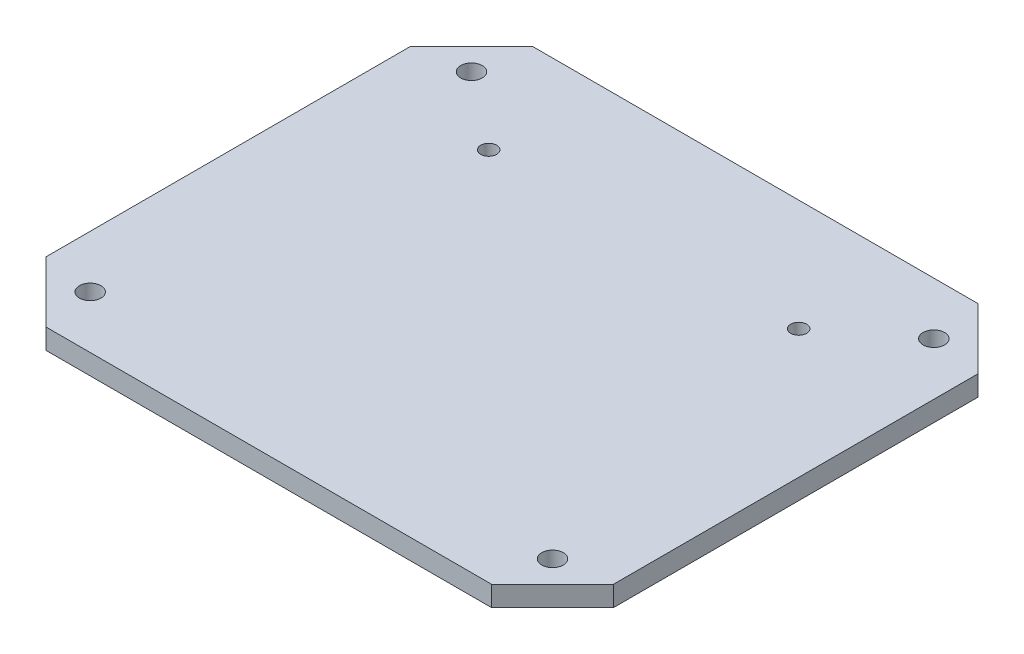
ISO-10303-21;
HEADER;
FILE_DESCRIPTION(('STEP AP214'),'2;1');
FILE_NAME('part.step','',(''),(''),'','','');
FILE_SCHEMA(('AUTOMOTIVE_DESIGN { 1 0 10303 214 1 1 1 1 }'));
ENDSEC;
DATA;
#1=APPLICATION_CONTEXT('core data for automotive mechanical design processes');
#2=APPLICATION_PROTOCOL_DEFINITION('international standard','automotive_design',2000,#1);
#3=PRODUCT_CONTEXT('',#1,'mechanical');
#4=PRODUCT('Part','Part','',(#3));
#5=PRODUCT_RELATED_PRODUCT_CATEGORY('part','',(#4));
#6=PRODUCT_DEFINITION_FORMATION('','',#4);
#7=PRODUCT_DEFINITION_CONTEXT('part definition',#1,'design');
#8=PRODUCT_DEFINITION('design','',#6,#7);
#9=PRODUCT_DEFINITION_SHAPE('','',#8);
#10=(LENGTH_UNIT() NAMED_UNIT(*) SI_UNIT(.MILLI.,.METRE.));
#11=(NAMED_UNIT(*) PLANE_ANGLE_UNIT() SI_UNIT($,.RADIAN.));
#12=(NAMED_UNIT(*) SI_UNIT($,.STERADIAN.) SOLID_ANGLE_UNIT());
#13=UNCERTAINTY_MEASURE_WITH_UNIT(LENGTH_MEASURE(1.E-05),#10,'distance_accuracy_value','');
#14=(GEOMETRIC_REPRESENTATION_CONTEXT(3) GLOBAL_UNCERTAINTY_ASSIGNED_CONTEXT((#13)) GLOBAL_UNIT_ASSIGNED_CONTEXT((#10,
#11,#12)) REPRESENTATION_CONTEXT('',''));
#15=CARTESIAN_POINT('',(0.,0.,0.));
#16=DIRECTION('',(0.,0.,1.));
#17=DIRECTION('',(1.,0.,0.));
#18=AXIS2_PLACEMENT_3D('',#15,#16,#17);
#19=CARTESIAN_POINT('',(0.,-6.35,0.));
#20=DIRECTION('',(0.,1.,0.));
#21=DIRECTION('',(0.,0.,1.));
#22=AXIS2_PLACEMENT_3D('',#19,#20,#21);
#23=PLANE('',#22);
#24=CARTESIAN_POINT('',(48.5775,-6.35,-41.275));
#25=DIRECTION('',(0.,1.,0.));
#26=DIRECTION('',(0.,0.,1.));
#27=AXIS2_PLACEMENT_3D('',#24,#25,#26);
#28=CIRCLE('',#27,2.5);
#29=CARTESIAN_POINT('',(48.5775,-6.35,-38.775));
#30=VERTEX_POINT('',#29);
#31=EDGE_CURVE('E214',#30,#30,#28,.T.);
#32=ORIENTED_EDGE('',*,*,#31,.T.);
#33=EDGE_LOOP('',(#32));
#34=FACE_BOUND('',#33,.T.);
#35=CARTESIAN_POINT('',(-48.5775,-6.35,-41.275));
#36=DIRECTION('',(0.,1.,0.));
#37=DIRECTION('',(0.,0.,1.));
#38=AXIS2_PLACEMENT_3D('',#35,#36,#37);
#39=CIRCLE('',#38,2.5);
#40=CARTESIAN_POINT('',(-48.5775,-6.35,-38.775));
#41=VERTEX_POINT('',#40);
#42=EDGE_CURVE('E208',#41,#41,#39,.T.);
#43=ORIENTED_EDGE('',*,*,#42,.T.);
#44=EDGE_LOOP('',(#43));
#45=FACE_BOUND('',#44,.T.);
#46=CARTESIAN_POINT('',(72.4526533333335,-6.35,-59.7526533333331));
#47=DIRECTION('',(0.,1.,0.));
#48=DIRECTION('',(0.,0.,1.));
#49=AXIS2_PLACEMENT_3D('',#46,#47,#48);
#50=CIRCLE('',#49,3.3782);
#51=CARTESIAN_POINT('',(72.4526533333335,-6.35,-56.3744533333331));
#52=VERTEX_POINT('',#51);
#53=EDGE_CURVE('E202',#52,#52,#50,.T.);
#54=ORIENTED_EDGE('',*,*,#53,.T.);
#55=EDGE_LOOP('',(#54));
#56=FACE_BOUND('',#55,.T.);
#57=CARTESIAN_POINT('',(72.4526533333335,-6.35,59.7526533333331));
#58=DIRECTION('',(0.,1.,0.));
#59=DIRECTION('',(0.,0.,1.));
#60=AXIS2_PLACEMENT_3D('',#57,#58,#59);
#61=CIRCLE('',#60,3.3782);
#62=CARTESIAN_POINT('',(72.4526533333335,-6.35,63.1308533333331));
#63=VERTEX_POINT('',#62);
#64=EDGE_CURVE('E196',#63,#63,#61,.T.);
#65=ORIENTED_EDGE('',*,*,#64,.T.);
#66=EDGE_LOOP('',(#65));
#67=FACE_BOUND('',#66,.T.);
#68=CARTESIAN_POINT('',(-72.4526533333335,-6.35,-59.7526533333331));
#69=DIRECTION('',(0.,1.,0.));
#70=DIRECTION('',(0.,0.,1.));
#71=AXIS2_PLACEMENT_3D('',#68,#69,#70);
#72=CIRCLE('',#71,3.3782);
#73=CARTESIAN_POINT('',(-72.4526533333335,-6.35,-56.3744533333331));
#74=VERTEX_POINT('',#73);
#75=EDGE_CURVE('E189',#74,#74,#72,.T.);
#76=ORIENTED_EDGE('',*,*,#75,.T.);
#77=EDGE_LOOP('',(#76));
#78=FACE_BOUND('',#77,.T.);
#79=CARTESIAN_POINT('',(-72.4526533333335,-6.35,59.7526533333331));
#80=DIRECTION('',(0.,1.,0.));
#81=DIRECTION('',(0.,0.,1.));
#82=AXIS2_PLACEMENT_3D('',#79,#80,#81);
#83=CIRCLE('',#82,3.3782);
#84=CARTESIAN_POINT('',(-72.4526533333335,-6.35,63.1308533333331));
#85=VERTEX_POINT('',#84);
#86=EDGE_CURVE('E163',#85,#85,#83,.T.);
#87=ORIENTED_EDGE('',*,*,#86,.T.);
#88=EDGE_LOOP('',(#87));
#89=FACE_BOUND('',#88,.T.);
#90=DIRECTION('',(-1.,0.,0.));
#91=VECTOR('',#90,1.);
#92=CARTESIAN_POINT('',(-88.9,-6.35,-76.2));
#93=LINE('',#92,#91);
#94=CARTESIAN_POINT('',(69.8500000000003,-6.35,-76.2));
#95=VERTEX_POINT('',#94);
#96=CARTESIAN_POINT('',(-69.8500000000003,-6.35,-76.1999999999998));
#97=VERTEX_POINT('',#96);
#98=EDGE_CURVE('E126',#95,#97,#93,.T.);
#99=ORIENTED_EDGE('',*,*,#98,.F.);
#100=DIRECTION('',(0.707106781186546,0.,0.707106781186549));
#101=VECTOR('',#100,1.);
#102=CARTESIAN_POINT('',(88.9000000000002,-6.35,-57.1499999999998));
#103=LINE('',#102,#101);
#104=CARTESIAN_POINT('',(88.9000000000002,-6.35,-57.1499999999998));
#105=VERTEX_POINT('',#104);
#106=EDGE_CURVE('E62',#95,#105,#103,.T.);
#107=ORIENTED_EDGE('',*,*,#106,.T.);
#108=DIRECTION('',(0.,0.,-1.));
#109=VECTOR('',#108,1.);
#110=CARTESIAN_POINT('',(88.9,-6.35,-76.2));
#111=LINE('',#110,#109);
#112=CARTESIAN_POINT('',(88.9000000000002,-6.35,57.1499999999998));
#113=VERTEX_POINT('',#112);
#114=EDGE_CURVE('E124',#113,#105,#111,.T.);
#115=ORIENTED_EDGE('',*,*,#114,.F.);
#116=DIRECTION('',(0.707106781186546,0.,-0.707106781186549));
#117=VECTOR('',#116,1.);
#118=CARTESIAN_POINT('',(88.9000000000002,-6.35,57.1499999999998));
#119=LINE('',#118,#117);
#120=CARTESIAN_POINT('',(69.8500000000003,-6.35,76.1999999999998));
#121=VERTEX_POINT('',#120);
#122=EDGE_CURVE('E184',#121,#113,#119,.T.);
#123=ORIENTED_EDGE('',*,*,#122,.F.);
#124=DIRECTION('',(1.,0.,0.));
#125=VECTOR('',#124,1.);
#126=CARTESIAN_POINT('',(-88.9,-6.35,76.2));
#127=LINE('',#126,#125);
#128=CARTESIAN_POINT('',(-69.8500000000003,-6.35,76.1999999999998));
#129=VERTEX_POINT('',#128);
#130=EDGE_CURVE('E11',#129,#121,#127,.T.);
#131=ORIENTED_EDGE('',*,*,#130,.F.);
#132=DIRECTION('',(-0.707106781186546,0.,-0.707106781186549));
#133=VECTOR('',#132,1.);
#134=CARTESIAN_POINT('',(-88.9000000000002,-6.35,57.1499999999998));
#135=LINE('',#134,#133);
#136=CARTESIAN_POINT('',(-88.9000000000002,-6.35,57.1499999999998));
#137=VERTEX_POINT('',#136);
#138=EDGE_CURVE('E162',#129,#137,#135,.T.);
#139=ORIENTED_EDGE('',*,*,#138,.T.);
#140=DIRECTION('',(0.,0.,1.));
#141=VECTOR('',#140,1.);
#142=CARTESIAN_POINT('',(-88.9,-6.35,-76.2));
#143=LINE('',#142,#141);
#144=CARTESIAN_POINT('',(-88.9000000000002,-6.35,-57.1499999999998));
#145=VERTEX_POINT('',#144);
#146=EDGE_CURVE('E54',#145,#137,#143,.T.);
#147=ORIENTED_EDGE('',*,*,#146,.F.);
#148=DIRECTION('',(-0.707106781186546,0.,0.707106781186549));
#149=VECTOR('',#148,1.);
#150=CARTESIAN_POINT('',(-88.9000000000002,-6.35,-57.1499999999998));
#151=LINE('',#150,#149);
#152=EDGE_CURVE('E177',#97,#145,#151,.T.);
#153=ORIENTED_EDGE('',*,*,#152,.F.);
#154=EDGE_LOOP('',(#99,#107,#115,#123,#131,#139,#147,#153));
#155=FACE_BOUND('',#154,.T.);
#156=ADVANCED_FACE('F45',(#34,#45,#56,#67,#78,#89,#155),#23,.F.);
#157=CARTESIAN_POINT('',(0.,0.,0.));
#158=DIRECTION('',(0.,1.,0.));
#159=DIRECTION('',(0.,0.,1.));
#160=AXIS2_PLACEMENT_3D('',#157,#158,#159);
#161=PLANE('',#160);
#162=CARTESIAN_POINT('',(48.5775,0.,-41.275));
#163=DIRECTION('',(0.,1.,0.));
#164=DIRECTION('',(0.,0.,1.));
#165=AXIS2_PLACEMENT_3D('',#162,#163,#164);
#166=CIRCLE('',#165,2.5);
#167=CARTESIAN_POINT('',(48.5775,0.,-38.775));
#168=VERTEX_POINT('',#167);
#169=EDGE_CURVE('E217',#168,#168,#166,.T.);
#170=ORIENTED_EDGE('',*,*,#169,.F.);
#171=EDGE_LOOP('',(#170));
#172=FACE_BOUND('',#171,.T.);
#173=CARTESIAN_POINT('',(-48.5775,0.,-41.275));
#174=DIRECTION('',(0.,1.,0.));
#175=DIRECTION('',(0.,0.,1.));
#176=AXIS2_PLACEMENT_3D('',#173,#174,#175);
#177=CIRCLE('',#176,2.5);
#178=CARTESIAN_POINT('',(-48.5775,0.,-38.775));
#179=VERTEX_POINT('',#178);
#180=EDGE_CURVE('E211',#179,#179,#177,.T.);
#181=ORIENTED_EDGE('',*,*,#180,.F.);
#182=EDGE_LOOP('',(#181));
#183=FACE_BOUND('',#182,.T.);
#184=CARTESIAN_POINT('',(72.4526533333335,0.,-59.7526533333331));
#185=DIRECTION('',(0.,1.,0.));
#186=DIRECTION('',(0.,0.,1.));
#187=AXIS2_PLACEMENT_3D('',#184,#185,#186);
#188=CIRCLE('',#187,3.3782);
#189=CARTESIAN_POINT('',(72.4526533333335,0.,-56.3744533333331));
#190=VERTEX_POINT('',#189);
#191=EDGE_CURVE('E205',#190,#190,#188,.T.);
#192=ORIENTED_EDGE('',*,*,#191,.F.);
#193=EDGE_LOOP('',(#192));
#194=FACE_BOUND('',#193,.T.);
#195=CARTESIAN_POINT('',(72.4526533333335,0.,59.7526533333331));
#196=DIRECTION('',(0.,1.,0.));
#197=DIRECTION('',(0.,0.,1.));
#198=AXIS2_PLACEMENT_3D('',#195,#196,#197);
#199=CIRCLE('',#198,3.3782);
#200=CARTESIAN_POINT('',(72.4526533333335,0.,63.1308533333331));
#201=VERTEX_POINT('',#200);
#202=EDGE_CURVE('E199',#201,#201,#199,.T.);
#203=ORIENTED_EDGE('',*,*,#202,.F.);
#204=EDGE_LOOP('',(#203));
#205=FACE_BOUND('',#204,.T.);
#206=CARTESIAN_POINT('',(-72.4526533333335,0.,-59.7526533333331));
#207=DIRECTION('',(0.,1.,0.));
#208=DIRECTION('',(0.,0.,1.));
#209=AXIS2_PLACEMENT_3D('',#206,#207,#208);
#210=CIRCLE('',#209,3.3782);
#211=CARTESIAN_POINT('',(-72.4526533333335,0.,-56.3744533333331));
#212=VERTEX_POINT('',#211);
#213=EDGE_CURVE('E193',#212,#212,#210,.T.);
#214=ORIENTED_EDGE('',*,*,#213,.F.);
#215=EDGE_LOOP('',(#214));
#216=FACE_BOUND('',#215,.T.);
#217=DIRECTION('',(0.707106781186546,0.,0.707106781186549));
#218=VECTOR('',#217,1.);
#219=CARTESIAN_POINT('',(88.9000000000002,0.,-57.1499999999998));
#220=LINE('',#219,#218);
#221=CARTESIAN_POINT('',(69.8500000000003,0.,-76.1999999999998));
#222=VERTEX_POINT('',#221);
#223=CARTESIAN_POINT('',(88.9000000000002,0.,-57.1499999999998));
#224=VERTEX_POINT('',#223);
#225=EDGE_CURVE('E113',#222,#224,#220,.T.);
#226=ORIENTED_EDGE('',*,*,#225,.F.);
#227=DIRECTION('',(-1.,0.,0.));
#228=VECTOR('',#227,1.);
#229=CARTESIAN_POINT('',(-88.9,0.,-76.2));
#230=LINE('',#229,#228);
#231=CARTESIAN_POINT('',(-69.8500000000003,0.,-76.1999999999998));
#232=VERTEX_POINT('',#231);
#233=EDGE_CURVE('E141',#222,#232,#230,.T.);
#234=ORIENTED_EDGE('',*,*,#233,.T.);
#235=DIRECTION('',(-0.707106781186546,0.,0.707106781186549));
#236=VECTOR('',#235,1.);
#237=CARTESIAN_POINT('',(-88.9000000000002,0.,-57.1499999999998));
#238=LINE('',#237,#236);
#239=CARTESIAN_POINT('',(-88.9,0.,-57.1500000000001));
#240=VERTEX_POINT('',#239);
#241=EDGE_CURVE('E153',#232,#240,#238,.T.);
#242=ORIENTED_EDGE('',*,*,#241,.T.);
#243=DIRECTION('',(0.,0.,1.));
#244=VECTOR('',#243,1.);
#245=CARTESIAN_POINT('',(-88.9,0.,-76.2));
#246=LINE('',#245,#244);
#247=CARTESIAN_POINT('',(-88.9000000000002,0.,57.1499999999998));
#248=VERTEX_POINT('',#247);
#249=EDGE_CURVE('E133',#240,#248,#246,.T.);
#250=ORIENTED_EDGE('',*,*,#249,.T.);
#251=DIRECTION('',(-0.707106781186546,0.,-0.707106781186549));
#252=VECTOR('',#251,1.);
#253=CARTESIAN_POINT('',(-88.9000000000002,0.,57.1499999999998));
#254=LINE('',#253,#252);
#255=CARTESIAN_POINT('',(-69.8500000000003,0.,76.2));
#256=VERTEX_POINT('',#255);
#257=EDGE_CURVE('E150',#256,#248,#254,.T.);
#258=ORIENTED_EDGE('',*,*,#257,.F.);
#259=DIRECTION('',(1.,0.,0.));
#260=VECTOR('',#259,1.);
#261=CARTESIAN_POINT('',(-88.9,0.,76.2));
#262=LINE('',#261,#260);
#263=CARTESIAN_POINT('',(69.8500000000003,0.,76.2));
#264=VERTEX_POINT('',#263);
#265=EDGE_CURVE('E49',#256,#264,#262,.T.);
#266=ORIENTED_EDGE('',*,*,#265,.T.);
#267=DIRECTION('',(0.707106781186546,0.,-0.707106781186549));
#268=VECTOR('',#267,1.);
#269=CARTESIAN_POINT('',(88.9000000000002,0.,57.1499999999998));
#270=LINE('',#269,#268);
#271=CARTESIAN_POINT('',(88.9000000000002,0.,57.1499999999998));
#272=VERTEX_POINT('',#271);
#273=EDGE_CURVE('E70',#264,#272,#270,.T.);
#274=ORIENTED_EDGE('',*,*,#273,.T.);
#275=DIRECTION('',(0.,0.,-1.));
#276=VECTOR('',#275,1.);
#277=CARTESIAN_POINT('',(88.9,0.,-76.2));
#278=LINE('',#277,#276);
#279=EDGE_CURVE('E139',#272,#224,#278,.T.);
#280=ORIENTED_EDGE('',*,*,#279,.T.);
#281=EDGE_LOOP('',(#226,#234,#242,#250,#258,#266,#274,#280));
#282=FACE_BOUND('',#281,.T.);
#283=CARTESIAN_POINT('',(-72.4526533333335,0.,59.7526533333331));
#284=DIRECTION('',(0.,1.,0.));
#285=DIRECTION('',(0.,0.,1.));
#286=AXIS2_PLACEMENT_3D('',#283,#284,#285);
#287=CIRCLE('',#286,3.3782);
#288=CARTESIAN_POINT('',(-72.4526533333335,0.,63.1308533333331));
#289=VERTEX_POINT('',#288);
#290=EDGE_CURVE('E171',#289,#289,#287,.T.);
#291=ORIENTED_EDGE('',*,*,#290,.F.);
#292=EDGE_LOOP('',(#291));
#293=FACE_BOUND('',#292,.T.);
#294=ADVANCED_FACE('F148',(#172,#183,#194,#205,#216,#282,#293),#161,.T.);
#295=CARTESIAN_POINT('',(88.9,-6.35,-76.2));
#296=DIRECTION('',(1.,0.,0.));
#297=DIRECTION('',(0.,0.,-1.));
#298=AXIS2_PLACEMENT_3D('',#295,#296,#297);
#299=PLANE('',#298);
#300=DIRECTION('',(0.,1.,0.));
#301=VECTOR('',#300,1.);
#302=CARTESIAN_POINT('',(88.9000000000002,-6.35,-57.1499999999998));
#303=LINE('',#302,#301);
#304=EDGE_CURVE('E110',#105,#224,#303,.T.);
#305=ORIENTED_EDGE('',*,*,#304,.T.);
#306=ORIENTED_EDGE('',*,*,#279,.F.);
#307=DIRECTION('',(0.,1.,0.));
#308=VECTOR('',#307,1.);
#309=CARTESIAN_POINT('',(88.9000000000002,-6.35,57.1499999999998));
#310=LINE('',#309,#308);
#311=EDGE_CURVE('E129',#113,#272,#310,.T.);
#312=ORIENTED_EDGE('',*,*,#311,.F.);
#313=ORIENTED_EDGE('',*,*,#114,.T.);
#314=EDGE_LOOP('',(#305,#306,#312,#313));
#315=FACE_BOUND('',#314,.T.);
#316=ADVANCED_FACE('F47',(#315),#299,.T.);
#317=CARTESIAN_POINT('',(-88.9,-6.35,76.2));
#318=DIRECTION('',(0.,0.,1.));
#319=DIRECTION('',(1.,0.,0.));
#320=AXIS2_PLACEMENT_3D('',#317,#318,#319);
#321=PLANE('',#320);
#322=ORIENTED_EDGE('',*,*,#130,.T.);
#323=DIRECTION('',(0.,1.,0.));
#324=VECTOR('',#323,1.);
#325=CARTESIAN_POINT('',(69.8500000000003,-6.35,76.1999999999998));
#326=LINE('',#325,#324);
#327=EDGE_CURVE('E181',#121,#264,#326,.T.);
#328=ORIENTED_EDGE('',*,*,#327,.T.);
#329=ORIENTED_EDGE('',*,*,#265,.F.);
#330=DIRECTION('',(0.,1.,0.));
#331=VECTOR('',#330,1.);
#332=CARTESIAN_POINT('',(-69.8500000000003,-6.35,76.1999999999998));
#333=LINE('',#332,#331);
#334=EDGE_CURVE('E135',#129,#256,#333,.T.);
#335=ORIENTED_EDGE('',*,*,#334,.F.);
#336=EDGE_LOOP('',(#322,#328,#329,#335));
#337=FACE_BOUND('',#336,.T.);
#338=ADVANCED_FACE('F259',(#337),#321,.T.);
#339=CARTESIAN_POINT('',(-88.9,-6.35,-76.2));
#340=DIRECTION('',(-1.,0.,0.));
#341=DIRECTION('',(0.,0.,1.));
#342=AXIS2_PLACEMENT_3D('',#339,#340,#341);
#343=PLANE('',#342);
#344=ORIENTED_EDGE('',*,*,#249,.F.);
#345=DIRECTION('',(0.,1.,0.));
#346=VECTOR('',#345,1.);
#347=CARTESIAN_POINT('',(-88.9000000000002,-6.35,-57.1499999999998));
#348=LINE('',#347,#346);
#349=EDGE_CURVE('E175',#145,#240,#348,.T.);
#350=ORIENTED_EDGE('',*,*,#349,.F.);
#351=ORIENTED_EDGE('',*,*,#146,.T.);
#352=DIRECTION('',(0.,1.,0.));
#353=VECTOR('',#352,1.);
#354=CARTESIAN_POINT('',(-88.9000000000002,-6.35,57.1499999999998));
#355=LINE('',#354,#353);
#356=EDGE_CURVE('E142',#137,#248,#355,.T.);
#357=ORIENTED_EDGE('',*,*,#356,.T.);
#358=EDGE_LOOP('',(#344,#350,#351,#357));
#359=FACE_BOUND('',#358,.T.);
#360=ADVANCED_FACE('F165',(#359),#343,.T.);
#361=CARTESIAN_POINT('',(-88.9,-6.35,-76.2));
#362=DIRECTION('',(0.,0.,-1.));
#363=DIRECTION('',(-1.,0.,0.));
#364=AXIS2_PLACEMENT_3D('',#361,#362,#363);
#365=PLANE('',#364);
#366=DIRECTION('',(0.,1.,0.));
#367=VECTOR('',#366,1.);
#368=CARTESIAN_POINT('',(69.8500000000003,-6.35,-76.1999999999998));
#369=LINE('',#368,#367);
#370=EDGE_CURVE('E118',#95,#222,#369,.T.);
#371=ORIENTED_EDGE('',*,*,#370,.F.);
#372=ORIENTED_EDGE('',*,*,#98,.T.);
#373=DIRECTION('',(0.,1.,0.));
#374=VECTOR('',#373,1.);
#375=CARTESIAN_POINT('',(-69.8500000000003,-6.35,-76.1999999999998));
#376=LINE('',#375,#374);
#377=EDGE_CURVE('E174',#97,#232,#376,.T.);
#378=ORIENTED_EDGE('',*,*,#377,.T.);
#379=ORIENTED_EDGE('',*,*,#233,.F.);
#380=EDGE_LOOP('',(#371,#372,#378,#379));
#381=FACE_BOUND('',#380,.T.);
#382=ADVANCED_FACE('F264',(#381),#365,.T.);
#383=CARTESIAN_POINT('',(-88.9000000000002,-6.35,57.1499999999998));
#384=DIRECTION('',(0.707106781186549,0.,-0.707106781186546));
#385=DIRECTION('',(-0.707106781186546,0.,-0.707106781186549));
#386=AXIS2_PLACEMENT_3D('',#383,#384,#385);
#387=PLANE('',#386);
#388=ORIENTED_EDGE('',*,*,#257,.T.);
#389=ORIENTED_EDGE('',*,*,#356,.F.);
#390=ORIENTED_EDGE('',*,*,#138,.F.);
#391=ORIENTED_EDGE('',*,*,#334,.T.);
#392=EDGE_LOOP('',(#388,#389,#390,#391));
#393=FACE_BOUND('',#392,.T.);
#394=ADVANCED_FACE('F159',(#393),#387,.F.);
#395=CARTESIAN_POINT('',(-72.4526533333335,0.,59.7526533333331));
#396=DIRECTION('',(0.,1.,0.));
#397=DIRECTION('',(0.,0.,1.));
#398=AXIS2_PLACEMENT_3D('',#395,#396,#397);
#399=CYLINDRICAL_SURFACE('',#398,3.3782);
#400=ORIENTED_EDGE('',*,*,#86,.F.);
#401=EDGE_LOOP('',(#400));
#402=FACE_BOUND('',#401,.T.);
#403=ORIENTED_EDGE('',*,*,#290,.T.);
#404=EDGE_LOOP('',(#403));
#405=FACE_BOUND('',#404,.T.);
#406=ADVANCED_FACE('F271',(#402,#405),#399,.F.);
#407=CARTESIAN_POINT('',(-88.9000000000002,-6.35,-57.1499999999998));
#408=DIRECTION('',(-0.707106781186549,0.,-0.707106781186546));
#409=DIRECTION('',(-0.707106781186546,0.,0.707106781186549));
#410=AXIS2_PLACEMENT_3D('',#407,#408,#409);
#411=PLANE('',#410);
#412=ORIENTED_EDGE('',*,*,#241,.F.);
#413=ORIENTED_EDGE('',*,*,#377,.F.);
#414=ORIENTED_EDGE('',*,*,#152,.T.);
#415=ORIENTED_EDGE('',*,*,#349,.T.);
#416=EDGE_LOOP('',(#412,#413,#414,#415));
#417=FACE_BOUND('',#416,.T.);
#418=ADVANCED_FACE('F276',(#417),#411,.T.);
#419=CARTESIAN_POINT('',(88.9000000000002,-6.35,57.1499999999998));
#420=DIRECTION('',(0.707106781186549,0.,0.707106781186546));
#421=DIRECTION('',(0.707106781186546,0.,-0.707106781186549));
#422=AXIS2_PLACEMENT_3D('',#419,#420,#421);
#423=PLANE('',#422);
#424=ORIENTED_EDGE('',*,*,#273,.F.);
#425=ORIENTED_EDGE('',*,*,#327,.F.);
#426=ORIENTED_EDGE('',*,*,#122,.T.);
#427=ORIENTED_EDGE('',*,*,#311,.T.);
#428=EDGE_LOOP('',(#424,#425,#426,#427));
#429=FACE_BOUND('',#428,.T.);
#430=ADVANCED_FACE('F246',(#429),#423,.T.);
#431=CARTESIAN_POINT('',(88.9000000000002,-6.35,-57.1499999999998));
#432=DIRECTION('',(-0.707106781186549,0.,0.707106781186546));
#433=DIRECTION('',(0.707106781186546,0.,0.707106781186549));
#434=AXIS2_PLACEMENT_3D('',#431,#432,#433);
#435=PLANE('',#434);
#436=ORIENTED_EDGE('',*,*,#225,.T.);
#437=ORIENTED_EDGE('',*,*,#304,.F.);
#438=ORIENTED_EDGE('',*,*,#106,.F.);
#439=ORIENTED_EDGE('',*,*,#370,.T.);
#440=EDGE_LOOP('',(#436,#437,#438,#439));
#441=FACE_BOUND('',#440,.T.);
#442=ADVANCED_FACE('F111',(#441),#435,.F.);
#443=CARTESIAN_POINT('',(-72.4526533333335,0.,-59.7526533333331));
#444=DIRECTION('',(0.,1.,0.));
#445=DIRECTION('',(0.,0.,1.));
#446=AXIS2_PLACEMENT_3D('',#443,#444,#445);
#447=CYLINDRICAL_SURFACE('',#446,3.3782);
#448=ORIENTED_EDGE('',*,*,#75,.F.);
#449=EDGE_LOOP('',(#448));
#450=FACE_BOUND('',#449,.T.);
#451=ORIENTED_EDGE('',*,*,#213,.T.);
#452=EDGE_LOOP('',(#451));
#453=FACE_BOUND('',#452,.T.);
#454=ADVANCED_FACE('F234',(#450,#453),#447,.F.);
#455=CARTESIAN_POINT('',(72.4526533333335,0.,59.7526533333331));
#456=DIRECTION('',(0.,1.,0.));
#457=DIRECTION('',(0.,0.,1.));
#458=AXIS2_PLACEMENT_3D('',#455,#456,#457);
#459=CYLINDRICAL_SURFACE('',#458,3.3782);
#460=ORIENTED_EDGE('',*,*,#64,.F.);
#461=EDGE_LOOP('',(#460));
#462=FACE_BOUND('',#461,.T.);
#463=ORIENTED_EDGE('',*,*,#202,.T.);
#464=EDGE_LOOP('',(#463));
#465=FACE_BOUND('',#464,.T.);
#466=ADVANCED_FACE('F236',(#462,#465),#459,.F.);
#467=CARTESIAN_POINT('',(72.4526533333335,0.,-59.7526533333331));
#468=DIRECTION('',(0.,1.,0.));
#469=DIRECTION('',(0.,0.,1.));
#470=AXIS2_PLACEMENT_3D('',#467,#468,#469);
#471=CYLINDRICAL_SURFACE('',#470,3.3782);
#472=ORIENTED_EDGE('',*,*,#53,.F.);
#473=EDGE_LOOP('',(#472));
#474=FACE_BOUND('',#473,.T.);
#475=ORIENTED_EDGE('',*,*,#191,.T.);
#476=EDGE_LOOP('',(#475));
#477=FACE_BOUND('',#476,.T.);
#478=ADVANCED_FACE('F243',(#474,#477),#471,.F.);
#479=CARTESIAN_POINT('',(-48.5775,0.,-41.275));
#480=DIRECTION('',(0.,1.,0.));
#481=DIRECTION('',(0.,0.,1.));
#482=AXIS2_PLACEMENT_3D('',#479,#480,#481);
#483=CYLINDRICAL_SURFACE('',#482,2.5);
#484=ORIENTED_EDGE('',*,*,#42,.F.);
#485=EDGE_LOOP('',(#484));
#486=FACE_BOUND('',#485,.T.);
#487=ORIENTED_EDGE('',*,*,#180,.T.);
#488=EDGE_LOOP('',(#487));
#489=FACE_BOUND('',#488,.T.);
#490=ADVANCED_FACE('F365',(#486,#489),#483,.F.);
#491=CARTESIAN_POINT('',(48.5775,0.,-41.275));
#492=DIRECTION('',(0.,1.,0.));
#493=DIRECTION('',(0.,0.,1.));
#494=AXIS2_PLACEMENT_3D('',#491,#492,#493);
#495=CYLINDRICAL_SURFACE('',#494,2.5);
#496=ORIENTED_EDGE('',*,*,#31,.F.);
#497=EDGE_LOOP('',(#496));
#498=FACE_BOUND('',#497,.T.);
#499=ORIENTED_EDGE('',*,*,#169,.T.);
#500=EDGE_LOOP('',(#499));
#501=FACE_BOUND('',#500,.T.);
#502=ADVANCED_FACE('F221',(#498,#501),#495,.F.);
#503=CLOSED_SHELL('',(#156,#294,#316,#338,#360,#382,#394,#406,#418,#430,#442,#454,#466,#478,
#490,#502));
#504=MANIFOLD_SOLID_BREP('B2',#503);
#505=ADVANCED_BREP_SHAPE_REPRESENTATION('',(#18,#504),#14);
#506=SHAPE_DEFINITION_REPRESENTATION(#9,#505);
ENDSEC;
END-ISO-10303-21;
